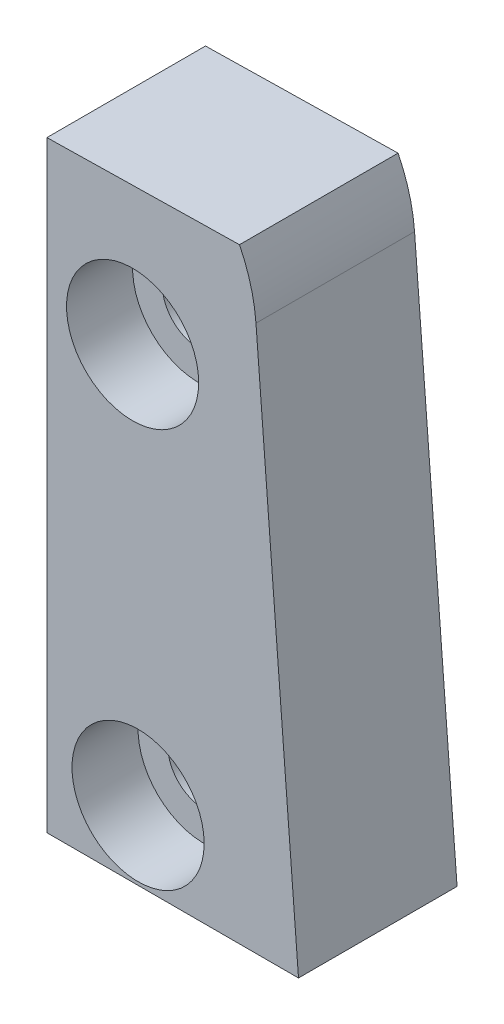
ISO-10303-21;
HEADER;
FILE_DESCRIPTION(('STEP AP214'),'2;1');
FILE_NAME('part.step','',(''),(''),'','','');
FILE_SCHEMA(('AUTOMOTIVE_DESIGN { 1 0 10303 214 1 1 1 1 }'));
ENDSEC;
DATA;
#1=APPLICATION_CONTEXT('core data for automotive mechanical design processes');
#2=APPLICATION_PROTOCOL_DEFINITION('international standard','automotive_design',2000,#1);
#3=PRODUCT_CONTEXT('',#1,'mechanical');
#4=PRODUCT('Part','Part','',(#3));
#5=PRODUCT_RELATED_PRODUCT_CATEGORY('part','',(#4));
#6=PRODUCT_DEFINITION_FORMATION('','',#4);
#7=PRODUCT_DEFINITION_CONTEXT('part definition',#1,'design');
#8=PRODUCT_DEFINITION('design','',#6,#7);
#9=PRODUCT_DEFINITION_SHAPE('','',#8);
#10=(LENGTH_UNIT() NAMED_UNIT(*) SI_UNIT(.MILLI.,.METRE.));
#11=(NAMED_UNIT(*) PLANE_ANGLE_UNIT() SI_UNIT($,.RADIAN.));
#12=(NAMED_UNIT(*) SI_UNIT($,.STERADIAN.) SOLID_ANGLE_UNIT());
#13=UNCERTAINTY_MEASURE_WITH_UNIT(LENGTH_MEASURE(1.E-05),#10,'distance_accuracy_value','');
#14=(GEOMETRIC_REPRESENTATION_CONTEXT(3) GLOBAL_UNCERTAINTY_ASSIGNED_CONTEXT((#13)) GLOBAL_UNIT_ASSIGNED_CONTEXT((#10,
#11,#12)) REPRESENTATION_CONTEXT('',''));
#15=CARTESIAN_POINT('',(0.,0.,0.));
#16=DIRECTION('',(0.,0.,1.));
#17=DIRECTION('',(1.,0.,0.));
#18=AXIS2_PLACEMENT_3D('',#15,#16,#17);
#19=CARTESIAN_POINT('',(-1.22382113356307,-7.59462182480509,4.8));
#20=DIRECTION('',(0.,0.,-1.));
#21=DIRECTION('',(-1.,0.,0.));
#22=AXIS2_PLACEMENT_3D('',#19,#20,#21);
#23=CYLINDRICAL_SURFACE('',#22,1.1);
#24=CARTESIAN_POINT('',(-1.22382113356307,-7.59462182480509,1.8));
#25=DIRECTION('',(0.,0.,1.));
#26=DIRECTION('',(1.,0.,0.));
#27=AXIS2_PLACEMENT_3D('',#24,#25,#26);
#28=CIRCLE('',#27,1.1);
#29=CARTESIAN_POINT('',(-0.123821133563065,-7.59462182480509,1.8));
#30=VERTEX_POINT('',#29);
#31=EDGE_CURVE('E187',#30,#30,#28,.T.);
#32=ORIENTED_EDGE('',*,*,#31,.F.);
#33=EDGE_LOOP('',(#32));
#34=FACE_BOUND('',#33,.T.);
#35=CARTESIAN_POINT('',(-1.22382113356307,-7.59462182480509,2.8));
#36=DIRECTION('',(0.,0.,1.));
#37=DIRECTION('',(1.,0.,0.));
#38=AXIS2_PLACEMENT_3D('',#35,#36,#37);
#39=CIRCLE('',#38,1.1);
#40=CARTESIAN_POINT('',(-0.123821133563065,-7.59462182480509,2.8));
#41=VERTEX_POINT('',#40);
#42=EDGE_CURVE('E43',#41,#41,#39,.T.);
#43=ORIENTED_EDGE('',*,*,#42,.T.);
#44=EDGE_LOOP('',(#43));
#45=FACE_BOUND('',#44,.T.);
#46=ADVANCED_FACE('F39',(#34,#45),#23,.F.);
#47=CARTESIAN_POINT('',(-1.38933849512214,4.40423662102307,4.8));
#48=DIRECTION('',(0.,0.,-1.));
#49=DIRECTION('',(-1.,0.,0.));
#50=AXIS2_PLACEMENT_3D('',#47,#48,#49);
#51=CYLINDRICAL_SURFACE('',#50,1.1);
#52=CARTESIAN_POINT('',(-1.38933849512214,4.40423662102307,1.8));
#53=DIRECTION('',(0.,0.,1.));
#54=DIRECTION('',(1.,0.,0.));
#55=AXIS2_PLACEMENT_3D('',#52,#53,#54);
#56=CIRCLE('',#55,1.1);
#57=CARTESIAN_POINT('',(-0.289338495122142,4.40423662102307,1.8));
#58=VERTEX_POINT('',#57);
#59=EDGE_CURVE('E185',#58,#58,#56,.T.);
#60=ORIENTED_EDGE('',*,*,#59,.F.);
#61=EDGE_LOOP('',(#60));
#62=FACE_BOUND('',#61,.T.);
#63=CARTESIAN_POINT('',(-1.38933849512214,4.40423662102307,2.8));
#64=DIRECTION('',(0.,0.,1.));
#65=DIRECTION('',(1.,0.,0.));
#66=AXIS2_PLACEMENT_3D('',#63,#64,#65);
#67=CIRCLE('',#66,1.1);
#68=CARTESIAN_POINT('',(-0.289338495122142,4.40423662102307,2.8));
#69=VERTEX_POINT('',#68);
#70=EDGE_CURVE('E247',#69,#69,#67,.T.);
#71=ORIENTED_EDGE('',*,*,#70,.T.);
#72=EDGE_LOOP('',(#71));
#73=FACE_BOUND('',#72,.T.);
#74=ADVANCED_FACE('F290',(#62,#73),#51,.F.);
#75=CARTESIAN_POINT('',(-2.56730969216806,6.44734427455029,1.8));
#76=DIRECTION('',(0.,0.,-1.));
#77=DIRECTION('',(-1.,0.,0.));
#78=AXIS2_PLACEMENT_3D('',#75,#76,#77);
#79=CYLINDRICAL_SURFACE('',#78,4.92699884637888);
#80=CARTESIAN_POINT('',(-2.56730969216806,6.44734427455029,0.));
#81=DIRECTION('',(0.,0.,1.));
#82=DIRECTION('',(1.,0.,0.));
#83=AXIS2_PLACEMENT_3D('',#80,#81,#82);
#84=CIRCLE('',#83,4.92699884637888);
#85=CARTESIAN_POINT('',(2.34480606853451,6.83001434873438,0.));
#86=VERTEX_POINT('',#85);
#87=CARTESIAN_POINT('',(1.84578532159205,8.63821397212351,0.));
#88=VERTEX_POINT('',#87);
#89=EDGE_CURVE('E216',#86,#88,#84,.T.);
#90=ORIENTED_EDGE('',*,*,#89,.T.);
#91=DIRECTION('',(0.,0.,-1.));
#92=VECTOR('',#91,1.);
#93=CARTESIAN_POINT('',(1.84578532159205,8.63821397212351,1.8));
#94=LINE('',#93,#92);
#95=CARTESIAN_POINT('',(1.84578532159204,8.6382139721235,4.8));
#96=VERTEX_POINT('',#95);
#97=EDGE_CURVE('E11',#96,#88,#94,.T.);
#98=ORIENTED_EDGE('',*,*,#97,.F.);
#99=CARTESIAN_POINT('',(-2.56730969216806,6.44734427455029,4.8));
#100=DIRECTION('',(0.,0.,1.));
#101=DIRECTION('',(1.,0.,0.));
#102=AXIS2_PLACEMENT_3D('',#99,#100,#101);
#103=CIRCLE('',#102,4.92699884637888);
#104=CARTESIAN_POINT('',(2.34480606853451,6.83001434873438,4.8));
#105=VERTEX_POINT('',#104);
#106=EDGE_CURVE('E204',#105,#96,#103,.T.);
#107=ORIENTED_EDGE('',*,*,#106,.F.);
#108=DIRECTION('',(0.,0.,-1.));
#109=VECTOR('',#108,1.);
#110=CARTESIAN_POINT('',(2.34480606853451,6.83001434873438,1.8));
#111=LINE('',#110,#109);
#112=EDGE_CURVE('E226',#105,#86,#111,.T.);
#113=ORIENTED_EDGE('',*,*,#112,.T.);
#114=EDGE_LOOP('',(#90,#98,#107,#113));
#115=FACE_BOUND('',#114,.T.);
#116=ADVANCED_FACE('F41',(#115),#79,.T.);
#117=CARTESIAN_POINT('',(-3.98264650724656,8.53179352333155,1.8));
#118=DIRECTION('',(0.0182558047915443,-0.999833348909414,0.));
#119=DIRECTION('',(0.999833348909414,0.0182558047915443,0.));
#120=AXIS2_PLACEMENT_3D('',#117,#118,#119);
#121=PLANE('',#120);
#122=DIRECTION('',(-0.999833348909413,-0.0182558047915443,0.));
#123=VECTOR('',#122,1.);
#124=CARTESIAN_POINT('',(-3.98264650724656,8.53179352333155,0.));
#125=LINE('',#124,#123);
#126=CARTESIAN_POINT('',(-3.98264650724656,8.53179352333155,0.));
#127=VERTEX_POINT('',#126);
#128=EDGE_CURVE('E228',#88,#127,#125,.T.);
#129=ORIENTED_EDGE('',*,*,#128,.T.);
#130=DIRECTION('',(0.,0.,-1.));
#131=VECTOR('',#130,1.);
#132=CARTESIAN_POINT('',(-3.98264650724656,8.53179352333155,1.8));
#133=LINE('',#132,#131);
#134=CARTESIAN_POINT('',(-3.98264650724656,8.53179352333155,1.8));
#135=VERTEX_POINT('',#134);
#136=EDGE_CURVE('E48',#135,#127,#133,.T.);
#137=ORIENTED_EDGE('',*,*,#136,.F.);
#138=DIRECTION('',(0.,0.,-1.));
#139=VECTOR('',#138,1.);
#140=CARTESIAN_POINT('',(-3.98264650724656,8.53179352333155,4.8));
#141=LINE('',#140,#139);
#142=CARTESIAN_POINT('',(-3.98264650724656,8.53179352333155,4.8));
#143=VERTEX_POINT('',#142);
#144=EDGE_CURVE('E213',#143,#135,#141,.T.);
#145=ORIENTED_EDGE('',*,*,#144,.F.);
#146=DIRECTION('',(-0.999833348909413,-0.0182558047915443,0.));
#147=VECTOR('',#146,1.);
#148=CARTESIAN_POINT('',(-3.98264650724656,8.53179352333155,4.8));
#149=LINE('',#148,#147);
#150=EDGE_CURVE('E195',#96,#143,#149,.T.);
#151=ORIENTED_EDGE('',*,*,#150,.F.);
#152=ORIENTED_EDGE('',*,*,#97,.T.);
#153=EDGE_LOOP('',(#129,#137,#145,#151,#152));
#154=FACE_BOUND('',#153,.T.);
#155=ADVANCED_FACE('F335',(#154),#121,.F.);
#156=CARTESIAN_POINT('',(-3.95959040027349,7.26905737387563,1.8));
#157=DIRECTION('',(0.999833348909414,0.0182558047915443,0.));
#158=DIRECTION('',(-0.0182558047915443,0.999833348909414,0.));
#159=AXIS2_PLACEMENT_3D('',#156,#157,#158);
#160=PLANE('',#159);
#161=DIRECTION('',(0.0182558047915443,-0.999833348909413,0.));
#162=VECTOR('',#161,1.);
#163=CARTESIAN_POINT('',(-3.95959040027349,7.26905737387563,0.));
#164=LINE('',#163,#162);
#165=CARTESIAN_POINT('',(-3.95959040027349,7.26905737387563,0.));
#166=VERTEX_POINT('',#165);
#167=EDGE_CURVE('E233',#127,#166,#164,.T.);
#168=ORIENTED_EDGE('',*,*,#167,.T.);
#169=DIRECTION('',(0.,0.,-1.));
#170=VECTOR('',#169,1.);
#171=CARTESIAN_POINT('',(-3.95959040027349,7.26905737387563,1.8));
#172=LINE('',#171,#170);
#173=CARTESIAN_POINT('',(-3.95959040027349,7.26905737387563,1.8));
#174=VERTEX_POINT('',#173);
#175=EDGE_CURVE('E250',#174,#166,#172,.T.);
#176=ORIENTED_EDGE('',*,*,#175,.F.);
#177=DIRECTION('',(0.0182558047915443,-0.999833348909413,0.));
#178=VECTOR('',#177,1.);
#179=CARTESIAN_POINT('',(-3.95959040027349,7.26905737387563,1.8));
#180=LINE('',#179,#178);
#181=EDGE_CURVE('E220',#135,#174,#180,.T.);
#182=ORIENTED_EDGE('',*,*,#181,.F.);
#183=ORIENTED_EDGE('',*,*,#136,.T.);
#184=EDGE_LOOP('',(#168,#176,#182,#183));
#185=FACE_BOUND('',#184,.T.);
#186=ADVANCED_FACE('F329',(#185),#160,.F.);
#187=CARTESIAN_POINT('',(1.97033803548242,7.35085733120917,1.8));
#188=DIRECTION('',(-0.0137931134632488,0.999904870485683,0.));
#189=DIRECTION('',(-0.999904870485683,-0.0137931134632488,0.));
#190=AXIS2_PLACEMENT_3D('',#187,#188,#189);
#191=PLANE('',#190);
#192=DIRECTION('',(0.999904870485683,0.0137931134632488,0.));
#193=VECTOR('',#192,1.);
#194=CARTESIAN_POINT('',(1.97033803548242,7.35085733120917,0.));
#195=LINE('',#194,#193);
#196=CARTESIAN_POINT('',(1.97033803548242,7.35085733120917,0.));
#197=VERTEX_POINT('',#196);
#198=EDGE_CURVE('E231',#166,#197,#195,.T.);
#199=ORIENTED_EDGE('',*,*,#198,.T.);
#200=DIRECTION('',(0.,0.,-1.));
#201=VECTOR('',#200,1.);
#202=CARTESIAN_POINT('',(1.97033803548242,7.35085733120917,1.8));
#203=LINE('',#202,#201);
#204=CARTESIAN_POINT('',(1.97033803548242,7.35085733120917,1.8));
#205=VERTEX_POINT('',#204);
#206=EDGE_CURVE('E64',#205,#197,#203,.T.);
#207=ORIENTED_EDGE('',*,*,#206,.F.);
#208=DIRECTION('',(0.999904870485683,0.0137931134632488,0.));
#209=VECTOR('',#208,1.);
#210=CARTESIAN_POINT('',(1.97033803548242,7.35085733120917,1.8));
#211=LINE('',#210,#209);
#212=EDGE_CURVE('E219',#174,#205,#211,.T.);
#213=ORIENTED_EDGE('',*,*,#212,.F.);
#214=ORIENTED_EDGE('',*,*,#175,.T.);
#215=EDGE_LOOP('',(#199,#207,#213,#214));
#216=FACE_BOUND('',#215,.T.);
#217=ADVANCED_FACE('F326',(#216),#191,.F.);
#218=CARTESIAN_POINT('',(2.20541631221245,-9.69068404915641,1.8));
#219=DIRECTION('',(0.999904870485683,0.0137931134632488,0.));
#220=DIRECTION('',(-0.0137931134632488,0.999904870485683,0.));
#221=AXIS2_PLACEMENT_3D('',#218,#219,#220);
#222=PLANE('',#221);
#223=DIRECTION('',(0.0137931134632488,-0.999904870485683,0.));
#224=VECTOR('',#223,1.);
#225=CARTESIAN_POINT('',(2.20541631221245,-9.69068404915641,0.));
#226=LINE('',#225,#224);
#227=CARTESIAN_POINT('',(2.20541631221245,-9.69068404915641,0.));
#228=VERTEX_POINT('',#227);
#229=EDGE_CURVE('E232',#197,#228,#226,.T.);
#230=ORIENTED_EDGE('',*,*,#229,.T.);
#231=DIRECTION('',(0.,0.,-1.));
#232=VECTOR('',#231,1.);
#233=CARTESIAN_POINT('',(2.20541631221245,-9.69068404915641,1.8));
#234=LINE('',#233,#232);
#235=CARTESIAN_POINT('',(2.20541631220053,-9.69068404915641,1.8));
#236=VERTEX_POINT('',#235);
#237=EDGE_CURVE('E242',#236,#228,#234,.T.);
#238=ORIENTED_EDGE('',*,*,#237,.F.);
#239=DIRECTION('',(0.0137931134625321,-0.999904870485693,0.));
#240=VECTOR('',#239,1.);
#241=CARTESIAN_POINT('',(1.97590192244876,6.94751419250535,1.8));
#242=LINE('',#241,#240);
#243=EDGE_CURVE('E224',#205,#236,#242,.T.);
#244=ORIENTED_EDGE('',*,*,#243,.F.);
#245=ORIENTED_EDGE('',*,*,#206,.T.);
#246=EDGE_LOOP('',(#230,#238,#244,#245));
#247=FACE_BOUND('',#246,.T.);
#248=ADVANCED_FACE('F325',(#247),#222,.F.);
#249=CARTESIAN_POINT('',(3.63182314823554,-9.69068404915641,1.8));
#250=DIRECTION('',(0.,1.,0.));
#251=DIRECTION('',(0.,0.,1.));
#252=AXIS2_PLACEMENT_3D('',#249,#250,#251);
#253=PLANE('',#252);
#254=DIRECTION('',(1.,0.,0.));
#255=VECTOR('',#254,1.);
#256=CARTESIAN_POINT('',(3.63182314823554,-9.69068404915641,0.));
#257=LINE('',#256,#255);
#258=CARTESIAN_POINT('',(3.63182314823554,-9.69068404915641,0.));
#259=VERTEX_POINT('',#258);
#260=EDGE_CURVE('E240',#228,#259,#257,.T.);
#261=ORIENTED_EDGE('',*,*,#260,.T.);
#262=DIRECTION('',(0.,0.,-1.));
#263=VECTOR('',#262,1.);
#264=CARTESIAN_POINT('',(3.63182314823554,-9.69068404915641,1.8));
#265=LINE('',#264,#263);
#266=CARTESIAN_POINT('',(3.63182314823554,-9.69068404915641,4.8));
#267=VERTEX_POINT('',#266);
#268=EDGE_CURVE('E241',#267,#259,#265,.T.);
#269=ORIENTED_EDGE('',*,*,#268,.F.);
#270=DIRECTION('',(1.,0.,0.));
#271=VECTOR('',#270,1.);
#272=CARTESIAN_POINT('',(-3.98264650724656,-9.69068404915641,4.8));
#273=LINE('',#272,#271);
#274=CARTESIAN_POINT('',(-3.98264650724656,-9.69068404915641,4.8));
#275=VERTEX_POINT('',#274);
#276=EDGE_CURVE('E196',#275,#267,#273,.T.);
#277=ORIENTED_EDGE('',*,*,#276,.F.);
#278=DIRECTION('',(0.,0.,-1.));
#279=VECTOR('',#278,1.);
#280=CARTESIAN_POINT('',(-3.98264650724656,-9.69068404915641,4.8));
#281=LINE('',#280,#279);
#282=CARTESIAN_POINT('',(-3.98264650724656,-9.69068404915641,1.8));
#283=VERTEX_POINT('',#282);
#284=EDGE_CURVE('E210',#275,#283,#281,.T.);
#285=ORIENTED_EDGE('',*,*,#284,.T.);
#286=DIRECTION('',(1.,0.,0.));
#287=VECTOR('',#286,1.);
#288=CARTESIAN_POINT('',(-3.98264650724656,-9.69068404915641,1.8));
#289=LINE('',#288,#287);
#290=EDGE_CURVE('E198',#283,#236,#289,.T.);
#291=ORIENTED_EDGE('',*,*,#290,.T.);
#292=ORIENTED_EDGE('',*,*,#237,.T.);
#293=EDGE_LOOP('',(#261,#269,#277,#285,#291,#292));
#294=FACE_BOUND('',#293,.T.);
#295=ADVANCED_FACE('F317',(#294),#253,.F.);
#296=CARTESIAN_POINT('',(2.34480606853451,6.83001434873438,1.8));
#297=DIRECTION('',(-0.996979279650689,-0.077667985342695,0.));
#298=DIRECTION('',(0.077667985342695,-0.996979279650689,0.));
#299=AXIS2_PLACEMENT_3D('',#296,#297,#298);
#300=PLANE('',#299);
#301=DIRECTION('',(-0.077667985342695,0.996979279650689,0.));
#302=VECTOR('',#301,1.);
#303=CARTESIAN_POINT('',(2.34480606853451,6.83001434873438,0.));
#304=LINE('',#303,#302);
#305=EDGE_CURVE('E96',#259,#86,#304,.T.);
#306=ORIENTED_EDGE('',*,*,#305,.T.);
#307=ORIENTED_EDGE('',*,*,#112,.F.);
#308=DIRECTION('',(-0.077667985342695,0.996979279650689,0.));
#309=VECTOR('',#308,1.);
#310=CARTESIAN_POINT('',(3.63182314823554,-9.69068404915641,4.8));
#311=LINE('',#310,#309);
#312=EDGE_CURVE('E203',#267,#105,#311,.T.);
#313=ORIENTED_EDGE('',*,*,#312,.F.);
#314=ORIENTED_EDGE('',*,*,#268,.T.);
#315=EDGE_LOOP('',(#306,#307,#313,#314));
#316=FACE_BOUND('',#315,.T.);
#317=ADVANCED_FACE('F312',(#316),#300,.F.);
#318=CARTESIAN_POINT('',(-2.56730969216806,6.44734427455029,0.));
#319=DIRECTION('',(0.,0.,1.));
#320=DIRECTION('',(1.,0.,0.));
#321=AXIS2_PLACEMENT_3D('',#318,#319,#320);
#322=PLANE('',#321);
#323=ORIENTED_EDGE('',*,*,#89,.F.);
#324=ORIENTED_EDGE('',*,*,#305,.F.);
#325=ORIENTED_EDGE('',*,*,#260,.F.);
#326=ORIENTED_EDGE('',*,*,#229,.F.);
#327=ORIENTED_EDGE('',*,*,#198,.F.);
#328=ORIENTED_EDGE('',*,*,#167,.F.);
#329=ORIENTED_EDGE('',*,*,#128,.F.);
#330=EDGE_LOOP('',(#323,#324,#325,#326,#327,#328,#329));
#331=FACE_BOUND('',#330,.T.);
#332=ADVANCED_FACE('F306',(#331),#322,.F.);
#333=CARTESIAN_POINT('',(-2.56730969216806,6.44734427455029,1.8));
#334=DIRECTION('',(0.,0.,1.));
#335=DIRECTION('',(1.,0.,0.));
#336=AXIS2_PLACEMENT_3D('',#333,#334,#335);
#337=PLANE('',#336);
#338=DIRECTION('',(0.,-1.,0.));
#339=VECTOR('',#338,1.);
#340=CARTESIAN_POINT('',(0.546432784080028,-5.19991259085085,1.8));
#341=LINE('',#340,#339);
#342=CARTESIAN_POINT('',(0.546432784080028,1.98471724359578,1.8));
#343=VERTEX_POINT('',#342);
#344=CARTESIAN_POINT('',(0.546432784080028,-5.19991259085085,1.8));
#345=VERTEX_POINT('',#344);
#346=EDGE_CURVE('E178',#343,#345,#341,.T.);
#347=ORIENTED_EDGE('',*,*,#346,.F.);
#348=DIRECTION('',(1.,0.,0.));
#349=VECTOR('',#348,1.);
#350=CARTESIAN_POINT('',(0.546432784080028,1.98471724359578,1.8));
#351=LINE('',#350,#349);
#352=CARTESIAN_POINT('',(-2.95356721591997,1.98471724359578,1.8));
#353=VERTEX_POINT('',#352);
#354=EDGE_CURVE('E57',#353,#343,#351,.T.);
#355=ORIENTED_EDGE('',*,*,#354,.F.);
#356=DIRECTION('',(0.,1.,0.));
#357=VECTOR('',#356,1.);
#358=CARTESIAN_POINT('',(-2.95356721591997,-5.19991259085085,1.8));
#359=LINE('',#358,#357);
#360=CARTESIAN_POINT('',(-2.95356721591997,-5.19991259085085,1.8));
#361=VERTEX_POINT('',#360);
#362=EDGE_CURVE('E163',#361,#353,#359,.T.);
#363=ORIENTED_EDGE('',*,*,#362,.F.);
#364=DIRECTION('',(-1.,0.,0.));
#365=VECTOR('',#364,1.);
#366=CARTESIAN_POINT('',(0.546432784080028,-5.19991259085085,1.8));
#367=LINE('',#366,#365);
#368=EDGE_CURVE('E170',#345,#361,#367,.T.);
#369=ORIENTED_EDGE('',*,*,#368,.F.);
#370=EDGE_LOOP('',(#347,#355,#363,#369));
#371=FACE_BOUND('',#370,.T.);
#372=ORIENTED_EDGE('',*,*,#31,.T.);
#373=EDGE_LOOP('',(#372));
#374=FACE_BOUND('',#373,.T.);
#375=ORIENTED_EDGE('',*,*,#59,.T.);
#376=EDGE_LOOP('',(#375));
#377=FACE_BOUND('',#376,.T.);
#378=DIRECTION('',(0.,-1.,0.));
#379=VECTOR('',#378,1.);
#380=CARTESIAN_POINT('',(-3.98264650724656,8.53179352333155,1.8));
#381=LINE('',#380,#379);
#382=EDGE_CURVE('E193',#135,#283,#381,.T.);
#383=ORIENTED_EDGE('',*,*,#382,.F.);
#384=ORIENTED_EDGE('',*,*,#181,.T.);
#385=ORIENTED_EDGE('',*,*,#212,.T.);
#386=ORIENTED_EDGE('',*,*,#243,.T.);
#387=ORIENTED_EDGE('',*,*,#290,.F.);
#388=EDGE_LOOP('',(#383,#384,#385,#386,#387));
#389=FACE_BOUND('',#388,.T.);
#390=ADVANCED_FACE('F304',(#371,#374,#377,#389),#337,.F.);
#391=CARTESIAN_POINT('',(-2.56730969216806,6.44734427455029,4.8));
#392=DIRECTION('',(0.,0.,1.));
#393=DIRECTION('',(1.,0.,0.));
#394=AXIS2_PLACEMENT_3D('',#391,#392,#393);
#395=PLANE('',#394);
#396=CARTESIAN_POINT('',(-1.38933849512214,4.40423662102307,4.8));
#397=DIRECTION('',(0.,0.,1.));
#398=DIRECTION('',(1.,0.,0.));
#399=AXIS2_PLACEMENT_3D('',#396,#397,#398);
#400=CIRCLE('',#399,2.);
#401=CARTESIAN_POINT('',(0.610661504877857,4.40423662102307,4.8));
#402=VERTEX_POINT('',#401);
#403=EDGE_CURVE('E260',#402,#402,#400,.T.);
#404=ORIENTED_EDGE('',*,*,#403,.F.);
#405=EDGE_LOOP('',(#404));
#406=FACE_BOUND('',#405,.T.);
#407=CARTESIAN_POINT('',(-1.22382113356307,-7.59462182480509,4.8));
#408=DIRECTION('',(0.,0.,1.));
#409=DIRECTION('',(1.,0.,0.));
#410=AXIS2_PLACEMENT_3D('',#407,#408,#409);
#411=CIRCLE('',#410,2.);
#412=CARTESIAN_POINT('',(0.776178866436935,-7.59462182480509,4.8));
#413=VERTEX_POINT('',#412);
#414=EDGE_CURVE('E265',#413,#413,#411,.T.);
#415=ORIENTED_EDGE('',*,*,#414,.F.);
#416=EDGE_LOOP('',(#415));
#417=FACE_BOUND('',#416,.T.);
#418=ORIENTED_EDGE('',*,*,#150,.T.);
#419=DIRECTION('',(0.,-1.,0.));
#420=VECTOR('',#419,1.);
#421=CARTESIAN_POINT('',(-3.98264650724656,8.53179352333155,4.8));
#422=LINE('',#421,#420);
#423=EDGE_CURVE('E192',#143,#275,#422,.T.);
#424=ORIENTED_EDGE('',*,*,#423,.T.);
#425=ORIENTED_EDGE('',*,*,#276,.T.);
#426=ORIENTED_EDGE('',*,*,#312,.T.);
#427=ORIENTED_EDGE('',*,*,#106,.T.);
#428=EDGE_LOOP('',(#418,#424,#425,#426,#427));
#429=FACE_BOUND('',#428,.T.);
#430=ADVANCED_FACE('F299',(#406,#417,#429),#395,.T.);
#431=CARTESIAN_POINT('',(-3.98264650724656,8.53179352333155,4.8));
#432=DIRECTION('',(1.,0.,0.));
#433=DIRECTION('',(0.,0.,-1.));
#434=AXIS2_PLACEMENT_3D('',#431,#432,#433);
#435=PLANE('',#434);
#436=ORIENTED_EDGE('',*,*,#382,.T.);
#437=ORIENTED_EDGE('',*,*,#284,.F.);
#438=ORIENTED_EDGE('',*,*,#423,.F.);
#439=ORIENTED_EDGE('',*,*,#144,.T.);
#440=EDGE_LOOP('',(#436,#437,#438,#439));
#441=FACE_BOUND('',#440,.T.);
#442=ADVANCED_FACE('F301',(#441),#435,.F.);
#443=CARTESIAN_POINT('',(0.546432784080028,1.98471724359578,3.8));
#444=DIRECTION('',(0.,1.,0.));
#445=DIRECTION('',(0.,0.,1.));
#446=AXIS2_PLACEMENT_3D('',#443,#444,#445);
#447=PLANE('',#446);
#448=ORIENTED_EDGE('',*,*,#354,.T.);
#449=DIRECTION('',(0.,0.,-1.));
#450=VECTOR('',#449,1.);
#451=CARTESIAN_POINT('',(0.546432784080028,1.98471724359578,3.8));
#452=LINE('',#451,#450);
#453=CARTESIAN_POINT('',(0.546432784080028,1.98471724359578,3.8));
#454=VERTEX_POINT('',#453);
#455=EDGE_CURVE('E142',#454,#343,#452,.T.);
#456=ORIENTED_EDGE('',*,*,#455,.F.);
#457=DIRECTION('',(1.,0.,0.));
#458=VECTOR('',#457,1.);
#459=CARTESIAN_POINT('',(0.546432784080028,1.98471724359578,3.8));
#460=LINE('',#459,#458);
#461=CARTESIAN_POINT('',(-2.95356721591997,1.98471724359578,3.8));
#462=VERTEX_POINT('',#461);
#463=EDGE_CURVE('E148',#462,#454,#460,.T.);
#464=ORIENTED_EDGE('',*,*,#463,.F.);
#465=DIRECTION('',(0.,0.,-1.));
#466=VECTOR('',#465,1.);
#467=CARTESIAN_POINT('',(-2.95356721591997,1.98471724359578,3.8));
#468=LINE('',#467,#466);
#469=EDGE_CURVE('E177',#462,#353,#468,.T.);
#470=ORIENTED_EDGE('',*,*,#469,.T.);
#471=EDGE_LOOP('',(#448,#456,#464,#470));
#472=FACE_BOUND('',#471,.T.);
#473=ADVANCED_FACE('F145',(#472),#447,.F.);
#474=CARTESIAN_POINT('',(-2.95356721591997,-5.19991259085085,3.8));
#475=DIRECTION('',(-1.,0.,0.));
#476=DIRECTION('',(0.,-1.,0.));
#477=AXIS2_PLACEMENT_3D('',#474,#475,#476);
#478=PLANE('',#477);
#479=ORIENTED_EDGE('',*,*,#362,.T.);
#480=ORIENTED_EDGE('',*,*,#469,.F.);
#481=DIRECTION('',(0.,1.,0.));
#482=VECTOR('',#481,1.);
#483=CARTESIAN_POINT('',(-2.95356721591997,-5.19991259085085,3.8));
#484=LINE('',#483,#482);
#485=CARTESIAN_POINT('',(-2.95356721591997,-5.19991259085085,3.8));
#486=VERTEX_POINT('',#485);
#487=EDGE_CURVE('E155',#486,#462,#484,.T.);
#488=ORIENTED_EDGE('',*,*,#487,.F.);
#489=DIRECTION('',(0.,0.,-1.));
#490=VECTOR('',#489,1.);
#491=CARTESIAN_POINT('',(-2.95356721591997,-5.19991259085085,3.8));
#492=LINE('',#491,#490);
#493=EDGE_CURVE('E181',#486,#361,#492,.T.);
#494=ORIENTED_EDGE('',*,*,#493,.T.);
#495=EDGE_LOOP('',(#479,#480,#488,#494));
#496=FACE_BOUND('',#495,.T.);
#497=ADVANCED_FACE('F406',(#496),#478,.F.);
#498=CARTESIAN_POINT('',(0.546432784080028,-5.19991259085085,3.8));
#499=DIRECTION('',(0.,-1.,0.));
#500=DIRECTION('',(1.,0.,0.));
#501=AXIS2_PLACEMENT_3D('',#498,#499,#500);
#502=PLANE('',#501);
#503=ORIENTED_EDGE('',*,*,#368,.T.);
#504=ORIENTED_EDGE('',*,*,#493,.F.);
#505=DIRECTION('',(-1.,0.,0.));
#506=VECTOR('',#505,1.);
#507=CARTESIAN_POINT('',(0.546432784080028,-5.19991259085085,3.8));
#508=LINE('',#507,#506);
#509=CARTESIAN_POINT('',(0.546432784080028,-5.19991259085085,3.8));
#510=VERTEX_POINT('',#509);
#511=EDGE_CURVE('E159',#510,#486,#508,.T.);
#512=ORIENTED_EDGE('',*,*,#511,.F.);
#513=DIRECTION('',(0.,0.,-1.));
#514=VECTOR('',#513,1.);
#515=CARTESIAN_POINT('',(0.546432784080028,-5.19991259085085,3.8));
#516=LINE('',#515,#514);
#517=EDGE_CURVE('E151',#510,#345,#516,.T.);
#518=ORIENTED_EDGE('',*,*,#517,.T.);
#519=EDGE_LOOP('',(#503,#504,#512,#518));
#520=FACE_BOUND('',#519,.T.);
#521=ADVANCED_FACE('F411',(#520),#502,.F.);
#522=CARTESIAN_POINT('',(0.546432784080028,-5.19991259085085,3.8));
#523=DIRECTION('',(1.,0.,0.));
#524=DIRECTION('',(0.,1.,0.));
#525=AXIS2_PLACEMENT_3D('',#522,#523,#524);
#526=PLANE('',#525);
#527=ORIENTED_EDGE('',*,*,#346,.T.);
#528=ORIENTED_EDGE('',*,*,#517,.F.);
#529=DIRECTION('',(0.,-1.,0.));
#530=VECTOR('',#529,1.);
#531=CARTESIAN_POINT('',(0.546432784080028,-5.19991259085085,3.8));
#532=LINE('',#531,#530);
#533=EDGE_CURVE('E154',#454,#510,#532,.T.);
#534=ORIENTED_EDGE('',*,*,#533,.F.);
#535=ORIENTED_EDGE('',*,*,#455,.T.);
#536=EDGE_LOOP('',(#527,#528,#534,#535));
#537=FACE_BOUND('',#536,.T.);
#538=ADVANCED_FACE('F156',(#537),#526,.F.);
#539=CARTESIAN_POINT('',(0.,0.,3.8));
#540=DIRECTION('',(0.,0.,-1.));
#541=DIRECTION('',(-1.,0.,0.));
#542=AXIS2_PLACEMENT_3D('',#539,#540,#541);
#543=PLANE('',#542);
#544=ORIENTED_EDGE('',*,*,#463,.T.);
#545=ORIENTED_EDGE('',*,*,#533,.T.);
#546=ORIENTED_EDGE('',*,*,#511,.T.);
#547=ORIENTED_EDGE('',*,*,#487,.T.);
#548=EDGE_LOOP('',(#544,#545,#546,#547));
#549=FACE_BOUND('',#548,.T.);
#550=ADVANCED_FACE('F165',(#549),#543,.T.);
#551=CARTESIAN_POINT('',(-1.38933849512214,4.40423662102307,2.8));
#552=DIRECTION('',(0.,0.,1.));
#553=DIRECTION('',(1.,0.,0.));
#554=AXIS2_PLACEMENT_3D('',#551,#552,#553);
#555=CYLINDRICAL_SURFACE('',#554,2.);
#556=CARTESIAN_POINT('',(-1.38933849512214,4.40423662102307,2.8));
#557=DIRECTION('',(0.,0.,1.));
#558=DIRECTION('',(1.,0.,0.));
#559=AXIS2_PLACEMENT_3D('',#556,#557,#558);
#560=CIRCLE('',#559,2.);
#561=CARTESIAN_POINT('',(0.610661504877857,4.40423662102307,2.8));
#562=VERTEX_POINT('',#561);
#563=EDGE_CURVE('E252',#562,#562,#560,.T.);
#564=ORIENTED_EDGE('',*,*,#563,.F.);
#565=EDGE_LOOP('',(#564));
#566=FACE_BOUND('',#565,.T.);
#567=ORIENTED_EDGE('',*,*,#403,.T.);
#568=EDGE_LOOP('',(#567));
#569=FACE_BOUND('',#568,.T.);
#570=ADVANCED_FACE('F285',(#566,#569),#555,.F.);
#571=CARTESIAN_POINT('',(-1.38933849512214,4.40423662102307,2.8));
#572=DIRECTION('',(0.,0.,1.));
#573=DIRECTION('',(1.,0.,0.));
#574=AXIS2_PLACEMENT_3D('',#571,#572,#573);
#575=PLANE('',#574);
#576=ORIENTED_EDGE('',*,*,#70,.F.);
#577=EDGE_LOOP('',(#576));
#578=FACE_BOUND('',#577,.T.);
#579=ORIENTED_EDGE('',*,*,#563,.T.);
#580=EDGE_LOOP('',(#579));
#581=FACE_BOUND('',#580,.T.);
#582=ADVANCED_FACE('F273',(#578,#581),#575,.T.);
#583=CARTESIAN_POINT('',(-1.22382113356307,-7.59462182480509,2.8));
#584=DIRECTION('',(0.,0.,1.));
#585=DIRECTION('',(1.,0.,0.));
#586=AXIS2_PLACEMENT_3D('',#583,#584,#585);
#587=CYLINDRICAL_SURFACE('',#586,2.);
#588=CARTESIAN_POINT('',(-1.22382113356307,-7.59462182480509,2.8));
#589=DIRECTION('',(0.,0.,1.));
#590=DIRECTION('',(1.,0.,0.));
#591=AXIS2_PLACEMENT_3D('',#588,#589,#590);
#592=CIRCLE('',#591,2.);
#593=CARTESIAN_POINT('',(0.776178866436935,-7.59462182480509,2.8));
#594=VERTEX_POINT('',#593);
#595=EDGE_CURVE('E168',#594,#594,#592,.T.);
#596=ORIENTED_EDGE('',*,*,#595,.F.);
#597=EDGE_LOOP('',(#596));
#598=FACE_BOUND('',#597,.T.);
#599=ORIENTED_EDGE('',*,*,#414,.T.);
#600=EDGE_LOOP('',(#599));
#601=FACE_BOUND('',#600,.T.);
#602=ADVANCED_FACE('F275',(#598,#601),#587,.F.);
#603=CARTESIAN_POINT('',(-1.22382113356307,-7.59462182480509,2.8));
#604=DIRECTION('',(0.,0.,1.));
#605=DIRECTION('',(1.,0.,0.));
#606=AXIS2_PLACEMENT_3D('',#603,#604,#605);
#607=PLANE('',#606);
#608=ORIENTED_EDGE('',*,*,#42,.F.);
#609=EDGE_LOOP('',(#608));
#610=FACE_BOUND('',#609,.T.);
#611=ORIENTED_EDGE('',*,*,#595,.T.);
#612=EDGE_LOOP('',(#611));
#613=FACE_BOUND('',#612,.T.);
#614=ADVANCED_FACE('F269',(#610,#613),#607,.T.);
#615=CLOSED_SHELL('',(#46,#74,#116,#155,#186,#217,#248,#295,#317,#332,#390,#430,#442,#473,#497,
#521,#538,#550,#570,#582,#602,#614));
#616=MANIFOLD_SOLID_BREP('B2',#615);
#617=ADVANCED_BREP_SHAPE_REPRESENTATION('',(#18,#616),#14);
#618=SHAPE_DEFINITION_REPRESENTATION(#9,#617);
ENDSEC;
END-ISO-10303-21;
